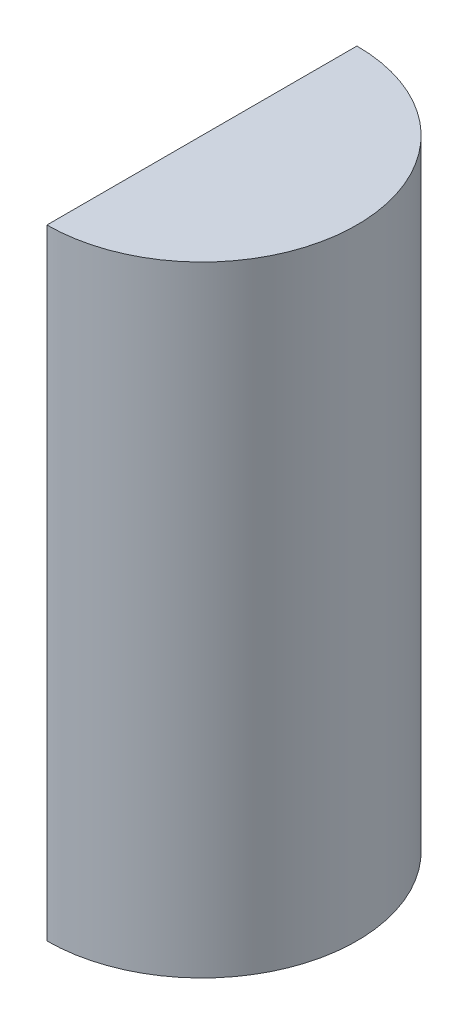
ISO-10303-21;
HEADER;
FILE_DESCRIPTION(('STEP AP214'),'2;1');
FILE_NAME('part.step','',(''),(''),'','','');
FILE_SCHEMA(('AUTOMOTIVE_DESIGN { 1 0 10303 214 1 1 1 1 }'));
ENDSEC;
DATA;
#1=APPLICATION_CONTEXT('core data for automotive mechanical design processes');
#2=APPLICATION_PROTOCOL_DEFINITION('international standard','automotive_design',2000,#1);
#3=PRODUCT_CONTEXT('',#1,'mechanical');
#4=PRODUCT('Part','Part','',(#3));
#5=PRODUCT_RELATED_PRODUCT_CATEGORY('part','',(#4));
#6=PRODUCT_DEFINITION_FORMATION('','',#4);
#7=PRODUCT_DEFINITION_CONTEXT('part definition',#1,'design');
#8=PRODUCT_DEFINITION('design','',#6,#7);
#9=PRODUCT_DEFINITION_SHAPE('','',#8);
#10=(LENGTH_UNIT() NAMED_UNIT(*) SI_UNIT(.MILLI.,.METRE.));
#11=(NAMED_UNIT(*) PLANE_ANGLE_UNIT() SI_UNIT($,.RADIAN.));
#12=(NAMED_UNIT(*) SI_UNIT($,.STERADIAN.) SOLID_ANGLE_UNIT());
#13=UNCERTAINTY_MEASURE_WITH_UNIT(LENGTH_MEASURE(1.E-05),#10,'distance_accuracy_value','');
#14=(GEOMETRIC_REPRESENTATION_CONTEXT(3) GLOBAL_UNCERTAINTY_ASSIGNED_CONTEXT((#13)) GLOBAL_UNIT_ASSIGNED_CONTEXT((#10,
#11,#12)) REPRESENTATION_CONTEXT('',''));
#15=CARTESIAN_POINT('',(0.,0.,0.));
#16=DIRECTION('',(0.,0.,1.));
#17=DIRECTION('',(1.,0.,0.));
#18=AXIS2_PLACEMENT_3D('',#15,#16,#17);
#19=CARTESIAN_POINT('',(0.,76.2,0.));
#20=DIRECTION('',(0.,-1.,0.));
#21=DIRECTION('',(0.,0.,-1.));
#22=AXIS2_PLACEMENT_3D('',#19,#20,#21);
#23=CYLINDRICAL_SURFACE('',#22,19.05);
#24=CARTESIAN_POINT('',(0.,0.,0.));
#25=DIRECTION('',(0.,1.,0.));
#26=DIRECTION('',(0.,0.,-1.));
#27=AXIS2_PLACEMENT_3D('',#24,#25,#26);
#28=CIRCLE('',#27,19.05);
#29=CARTESIAN_POINT('',(0.,0.,19.05));
#30=VERTEX_POINT('',#29);
#31=CARTESIAN_POINT('',(0.,0.,-19.05));
#32=VERTEX_POINT('',#31);
#33=EDGE_CURVE('E66',#30,#32,#28,.T.);
#34=ORIENTED_EDGE('',*,*,#33,.T.);
#35=DIRECTION('',(0.,-1.,0.));
#36=VECTOR('',#35,1.);
#37=CARTESIAN_POINT('',(0.,76.2,-19.05));
#38=LINE('',#37,#36);
#39=CARTESIAN_POINT('',(0.,76.2,-19.05));
#40=VERTEX_POINT('',#39);
#41=EDGE_CURVE('E11',#40,#32,#38,.T.);
#42=ORIENTED_EDGE('',*,*,#41,.F.);
#43=CARTESIAN_POINT('',(0.,76.2,0.));
#44=DIRECTION('',(0.,1.,0.));
#45=DIRECTION('',(0.,0.,-1.));
#46=AXIS2_PLACEMENT_3D('',#43,#44,#45);
#47=CIRCLE('',#46,19.05);
#48=CARTESIAN_POINT('',(0.,76.2,19.05));
#49=VERTEX_POINT('',#48);
#50=EDGE_CURVE('E65',#49,#40,#47,.T.);
#51=ORIENTED_EDGE('',*,*,#50,.F.);
#52=DIRECTION('',(0.,-1.,0.));
#53=VECTOR('',#52,1.);
#54=CARTESIAN_POINT('',(0.,76.2,19.05));
#55=LINE('',#54,#53);
#56=EDGE_CURVE('E43',#49,#30,#55,.T.);
#57=ORIENTED_EDGE('',*,*,#56,.T.);
#58=EDGE_LOOP('',(#34,#42,#51,#57));
#59=FACE_BOUND('',#58,.T.);
#60=ADVANCED_FACE('F35',(#59),#23,.T.);
#61=CARTESIAN_POINT('',(0.,76.2,-19.05));
#62=DIRECTION('',(1.,0.,0.));
#63=DIRECTION('',(0.,0.,-1.));
#64=AXIS2_PLACEMENT_3D('',#61,#62,#63);
#65=PLANE('',#64);
#66=DIRECTION('',(0.,0.,1.));
#67=VECTOR('',#66,1.);
#68=CARTESIAN_POINT('',(0.,0.,-19.05));
#69=LINE('',#68,#67);
#70=EDGE_CURVE('E58',#32,#30,#69,.T.);
#71=ORIENTED_EDGE('',*,*,#70,.T.);
#72=ORIENTED_EDGE('',*,*,#56,.F.);
#73=DIRECTION('',(0.,0.,1.));
#74=VECTOR('',#73,1.);
#75=CARTESIAN_POINT('',(0.,76.2,-19.05));
#76=LINE('',#75,#74);
#77=EDGE_CURVE('E50',#40,#49,#76,.T.);
#78=ORIENTED_EDGE('',*,*,#77,.F.);
#79=ORIENTED_EDGE('',*,*,#41,.T.);
#80=EDGE_LOOP('',(#71,#72,#78,#79));
#81=FACE_BOUND('',#80,.T.);
#82=ADVANCED_FACE('F61',(#81),#65,.F.);
#83=CARTESIAN_POINT('',(0.,76.2,0.));
#84=DIRECTION('',(0.,-1.,0.));
#85=DIRECTION('',(0.,0.,-1.));
#86=AXIS2_PLACEMENT_3D('',#83,#84,#85);
#87=PLANE('',#86);
#88=ORIENTED_EDGE('',*,*,#50,.T.);
#89=ORIENTED_EDGE('',*,*,#77,.T.);
#90=EDGE_LOOP('',(#88,#89));
#91=FACE_BOUND('',#90,.T.);
#92=ADVANCED_FACE('F73',(#91),#87,.F.);
#93=CARTESIAN_POINT('',(0.,0.,0.));
#94=DIRECTION('',(0.,-1.,0.));
#95=DIRECTION('',(0.,0.,-1.));
#96=AXIS2_PLACEMENT_3D('',#93,#94,#95);
#97=PLANE('',#96);
#98=ORIENTED_EDGE('',*,*,#33,.F.);
#99=ORIENTED_EDGE('',*,*,#70,.F.);
#100=EDGE_LOOP('',(#98,#99));
#101=FACE_BOUND('',#100,.T.);
#102=ADVANCED_FACE('F69',(#101),#97,.T.);
#103=CLOSED_SHELL('',(#60,#82,#92,#102));
#104=MANIFOLD_SOLID_BREP('B2',#103);
#105=ADVANCED_BREP_SHAPE_REPRESENTATION('',(#18,#104),#14);
#106=SHAPE_DEFINITION_REPRESENTATION(#9,#105);
ENDSEC;
END-ISO-10303-21;
